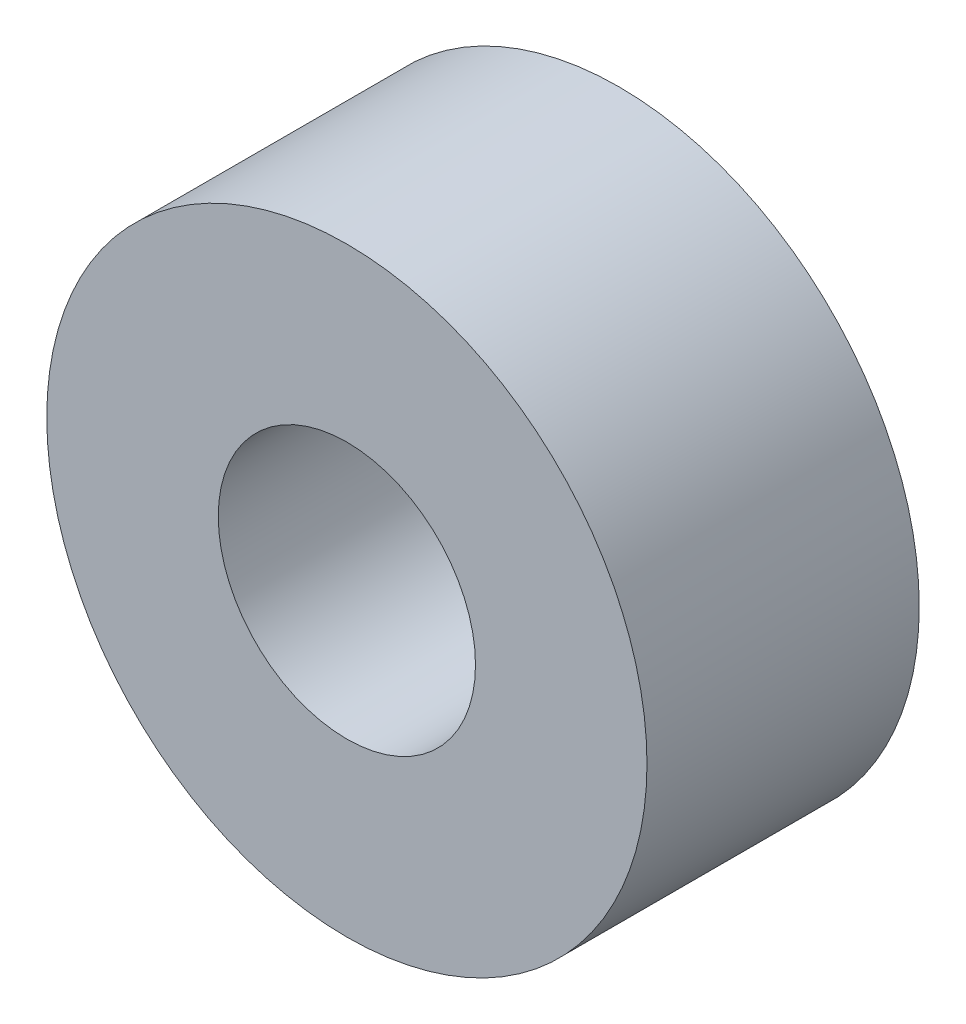
ISO-10303-21;
HEADER;
FILE_DESCRIPTION(('STEP AP214'),'2;1');
FILE_NAME('part.step','',(''),(''),'','','');
FILE_SCHEMA(('AUTOMOTIVE_DESIGN { 1 0 10303 214 1 1 1 1 }'));
ENDSEC;
DATA;
#1=APPLICATION_CONTEXT('core data for automotive mechanical design processes');
#2=APPLICATION_PROTOCOL_DEFINITION('international standard','automotive_design',2000,#1);
#3=PRODUCT_CONTEXT('',#1,'mechanical');
#4=PRODUCT('Part','Part','',(#3));
#5=PRODUCT_RELATED_PRODUCT_CATEGORY('part','',(#4));
#6=PRODUCT_DEFINITION_FORMATION('','',#4);
#7=PRODUCT_DEFINITION_CONTEXT('part definition',#1,'design');
#8=PRODUCT_DEFINITION('design','',#6,#7);
#9=PRODUCT_DEFINITION_SHAPE('','',#8);
#10=(LENGTH_UNIT() NAMED_UNIT(*) SI_UNIT(.MILLI.,.METRE.));
#11=(NAMED_UNIT(*) PLANE_ANGLE_UNIT() SI_UNIT($,.RADIAN.));
#12=(NAMED_UNIT(*) SI_UNIT($,.STERADIAN.) SOLID_ANGLE_UNIT());
#13=UNCERTAINTY_MEASURE_WITH_UNIT(LENGTH_MEASURE(1.E-05),#10,'distance_accuracy_value','');
#14=(GEOMETRIC_REPRESENTATION_CONTEXT(3) GLOBAL_UNCERTAINTY_ASSIGNED_CONTEXT((#13)) GLOBAL_UNIT_ASSIGNED_CONTEXT((#10,
#11,#12)) REPRESENTATION_CONTEXT('',''));
#15=CARTESIAN_POINT('',(0.,0.,0.));
#16=DIRECTION('',(0.,0.,1.));
#17=DIRECTION('',(1.,0.,0.));
#18=AXIS2_PLACEMENT_3D('',#15,#16,#17);
#19=CARTESIAN_POINT('',(0.,0.,3.175));
#20=DIRECTION('',(0.,0.,1.));
#21=DIRECTION('',(1.,0.,0.));
#22=AXIS2_PLACEMENT_3D('',#19,#20,#21);
#23=PLANE('',#22);
#24=CARTESIAN_POINT('',(0.,0.,3.175));
#25=DIRECTION('',(0.,0.,1.));
#26=DIRECTION('',(1.,0.,0.));
#27=AXIS2_PLACEMENT_3D('',#24,#25,#26);
#28=CIRCLE('',#27,3.5);
#29=CARTESIAN_POINT('',(3.5,0.,3.175));
#30=VERTEX_POINT('',#29);
#31=EDGE_CURVE('E10',#30,#30,#28,.T.);
#32=ORIENTED_EDGE('',*,*,#31,.T.);
#33=EDGE_LOOP('',(#32));
#34=FACE_BOUND('',#33,.T.);
#35=CARTESIAN_POINT('',(0.,0.,3.175));
#36=DIRECTION('',(0.,0.,1.));
#37=DIRECTION('',(1.,0.,0.));
#38=AXIS2_PLACEMENT_3D('',#35,#36,#37);
#39=CIRCLE('',#38,1.5);
#40=CARTESIAN_POINT('',(1.5,0.,3.175));
#41=VERTEX_POINT('',#40);
#42=EDGE_CURVE('E46',#41,#41,#39,.T.);
#43=ORIENTED_EDGE('',*,*,#42,.F.);
#44=EDGE_LOOP('',(#43));
#45=FACE_BOUND('',#44,.T.);
#46=ADVANCED_FACE('F35',(#34,#45),#23,.T.);
#47=CARTESIAN_POINT('',(0.,0.,0.));
#48=DIRECTION('',(0.,0.,1.));
#49=DIRECTION('',(1.,0.,0.));
#50=AXIS2_PLACEMENT_3D('',#47,#48,#49);
#51=PLANE('',#50);
#52=CARTESIAN_POINT('',(0.,0.,0.));
#53=DIRECTION('',(0.,0.,1.));
#54=DIRECTION('',(1.,0.,0.));
#55=AXIS2_PLACEMENT_3D('',#52,#53,#54);
#56=CIRCLE('',#55,3.5);
#57=CARTESIAN_POINT('',(3.5,0.,0.));
#58=VERTEX_POINT('',#57);
#59=EDGE_CURVE('E39',#58,#58,#56,.T.);
#60=ORIENTED_EDGE('',*,*,#59,.F.);
#61=EDGE_LOOP('',(#60));
#62=FACE_BOUND('',#61,.T.);
#63=CARTESIAN_POINT('',(0.,0.,0.));
#64=DIRECTION('',(0.,0.,1.));
#65=DIRECTION('',(1.,0.,0.));
#66=AXIS2_PLACEMENT_3D('',#63,#64,#65);
#67=CIRCLE('',#66,1.5);
#68=CARTESIAN_POINT('',(1.5,0.,0.));
#69=VERTEX_POINT('',#68);
#70=EDGE_CURVE('E48',#69,#69,#67,.T.);
#71=ORIENTED_EDGE('',*,*,#70,.T.);
#72=EDGE_LOOP('',(#71));
#73=FACE_BOUND('',#72,.T.);
#74=ADVANCED_FACE('F58',(#62,#73),#51,.F.);
#75=CARTESIAN_POINT('',(0.,0.,3.175));
#76=DIRECTION('',(0.,0.,-1.));
#77=DIRECTION('',(-1.,0.,0.));
#78=AXIS2_PLACEMENT_3D('',#75,#76,#77);
#79=CYLINDRICAL_SURFACE('',#78,3.5);
#80=ORIENTED_EDGE('',*,*,#31,.F.);
#81=EDGE_LOOP('',(#80));
#82=FACE_BOUND('',#81,.T.);
#83=ORIENTED_EDGE('',*,*,#59,.T.);
#84=EDGE_LOOP('',(#83));
#85=FACE_BOUND('',#84,.T.);
#86=ADVANCED_FACE('F37',(#82,#85),#79,.T.);
#87=CARTESIAN_POINT('',(0.,0.,3.175));
#88=DIRECTION('',(0.,0.,-1.));
#89=DIRECTION('',(-1.,0.,0.));
#90=AXIS2_PLACEMENT_3D('',#87,#88,#89);
#91=CYLINDRICAL_SURFACE('',#90,1.5);
#92=ORIENTED_EDGE('',*,*,#42,.T.);
#93=EDGE_LOOP('',(#92));
#94=FACE_BOUND('',#93,.T.);
#95=ORIENTED_EDGE('',*,*,#70,.F.);
#96=EDGE_LOOP('',(#95));
#97=FACE_BOUND('',#96,.T.);
#98=ADVANCED_FACE('F54',(#94,#97),#91,.F.);
#99=CLOSED_SHELL('',(#46,#74,#86,#98));
#100=MANIFOLD_SOLID_BREP('B2',#99);
#101=ADVANCED_BREP_SHAPE_REPRESENTATION('',(#18,#100),#14);
#102=SHAPE_DEFINITION_REPRESENTATION(#9,#101);
ENDSEC;
END-ISO-10303-21;
